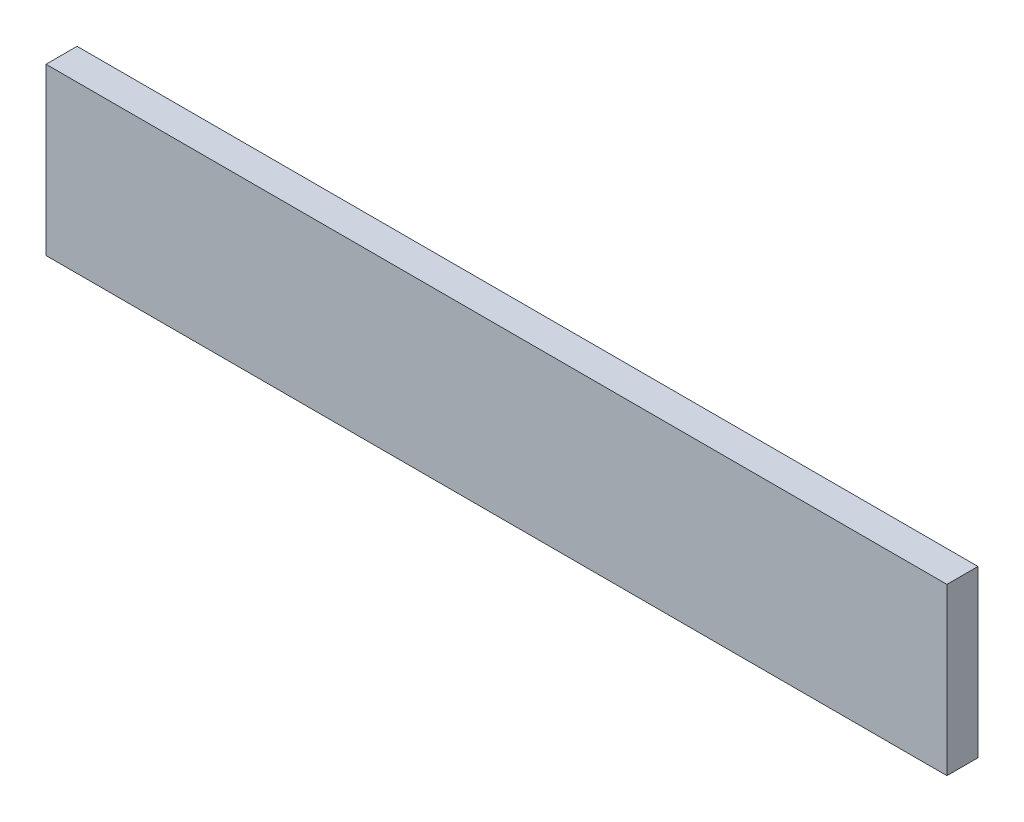
ISO-10303-21;
HEADER;
FILE_DESCRIPTION(('STEP AP214'),'2;1');
FILE_NAME('part.step','',(''),(''),'','','');
FILE_SCHEMA(('AUTOMOTIVE_DESIGN { 1 0 10303 214 1 1 1 1 }'));
ENDSEC;
DATA;
#1=APPLICATION_CONTEXT('core data for automotive mechanical design processes');
#2=APPLICATION_PROTOCOL_DEFINITION('international standard','automotive_design',2000,#1);
#3=PRODUCT_CONTEXT('',#1,'mechanical');
#4=PRODUCT('Part','Part','',(#3));
#5=PRODUCT_RELATED_PRODUCT_CATEGORY('part','',(#4));
#6=PRODUCT_DEFINITION_FORMATION('','',#4);
#7=PRODUCT_DEFINITION_CONTEXT('part definition',#1,'design');
#8=PRODUCT_DEFINITION('design','',#6,#7);
#9=PRODUCT_DEFINITION_SHAPE('','',#8);
#10=(LENGTH_UNIT() NAMED_UNIT(*) SI_UNIT(.MILLI.,.METRE.));
#11=(NAMED_UNIT(*) PLANE_ANGLE_UNIT() SI_UNIT($,.RADIAN.));
#12=(NAMED_UNIT(*) SI_UNIT($,.STERADIAN.) SOLID_ANGLE_UNIT());
#13=UNCERTAINTY_MEASURE_WITH_UNIT(LENGTH_MEASURE(1.E-05),#10,'distance_accuracy_value','');
#14=(GEOMETRIC_REPRESENTATION_CONTEXT(3) GLOBAL_UNCERTAINTY_ASSIGNED_CONTEXT((#13)) GLOBAL_UNIT_ASSIGNED_CONTEXT((#10,
#11,#12)) REPRESENTATION_CONTEXT('',''));
#15=CARTESIAN_POINT('',(0.,0.,0.));
#16=DIRECTION('',(0.,0.,1.));
#17=DIRECTION('',(1.,0.,0.));
#18=AXIS2_PLACEMENT_3D('',#15,#16,#17);
#19=CARTESIAN_POINT('',(276.225,-50.8,19.05));
#20=DIRECTION('',(-1.,0.,0.));
#21=DIRECTION('',(0.,0.,1.));
#22=AXIS2_PLACEMENT_3D('',#19,#20,#21);
#23=PLANE('',#22);
#24=DIRECTION('',(0.,1.,0.));
#25=VECTOR('',#24,1.);
#26=CARTESIAN_POINT('',(276.225,-50.8,0.));
#27=LINE('',#26,#25);
#28=CARTESIAN_POINT('',(276.225,-50.8,0.));
#29=VERTEX_POINT('',#28);
#30=CARTESIAN_POINT('',(276.225,50.8,0.));
#31=VERTEX_POINT('',#30);
#32=EDGE_CURVE('E107',#29,#31,#27,.T.);
#33=ORIENTED_EDGE('',*,*,#32,.T.);
#34=DIRECTION('',(0.,0.,-1.));
#35=VECTOR('',#34,1.);
#36=CARTESIAN_POINT('',(276.225,50.8,19.05));
#37=LINE('',#36,#35);
#38=CARTESIAN_POINT('',(276.225,50.8,19.05));
#39=VERTEX_POINT('',#38);
#40=EDGE_CURVE('E11',#39,#31,#37,.T.);
#41=ORIENTED_EDGE('',*,*,#40,.F.);
#42=DIRECTION('',(0.,1.,0.));
#43=VECTOR('',#42,1.);
#44=CARTESIAN_POINT('',(276.225,-50.8,19.05));
#45=LINE('',#44,#43);
#46=CARTESIAN_POINT('',(276.225,-50.8,19.05));
#47=VERTEX_POINT('',#46);
#48=EDGE_CURVE('E91',#47,#39,#45,.T.);
#49=ORIENTED_EDGE('',*,*,#48,.F.);
#50=DIRECTION('',(0.,0.,-1.));
#51=VECTOR('',#50,1.);
#52=CARTESIAN_POINT('',(276.225,-50.8,19.05));
#53=LINE('',#52,#51);
#54=EDGE_CURVE('E103',#47,#29,#53,.T.);
#55=ORIENTED_EDGE('',*,*,#54,.T.);
#56=EDGE_LOOP('',(#33,#41,#49,#55));
#57=FACE_BOUND('',#56,.T.);
#58=ADVANCED_FACE('F39',(#57),#23,.F.);
#59=CARTESIAN_POINT('',(-276.225,50.8,19.05));
#60=DIRECTION('',(0.,-1.,0.));
#61=DIRECTION('',(0.,0.,-1.));
#62=AXIS2_PLACEMENT_3D('',#59,#60,#61);
#63=PLANE('',#62);
#64=DIRECTION('',(-1.,0.,0.));
#65=VECTOR('',#64,1.);
#66=CARTESIAN_POINT('',(-276.225,50.8,0.));
#67=LINE('',#66,#65);
#68=CARTESIAN_POINT('',(-276.225,50.8,0.));
#69=VERTEX_POINT('',#68);
#70=EDGE_CURVE('E96',#31,#69,#67,.T.);
#71=ORIENTED_EDGE('',*,*,#70,.T.);
#72=DIRECTION('',(0.,0.,-1.));
#73=VECTOR('',#72,1.);
#74=CARTESIAN_POINT('',(-276.225,50.8,19.05));
#75=LINE('',#74,#73);
#76=CARTESIAN_POINT('',(-276.225,50.8,19.05));
#77=VERTEX_POINT('',#76);
#78=EDGE_CURVE('E48',#77,#69,#75,.T.);
#79=ORIENTED_EDGE('',*,*,#78,.F.);
#80=DIRECTION('',(-1.,0.,0.));
#81=VECTOR('',#80,1.);
#82=CARTESIAN_POINT('',(-276.225,50.8,19.05));
#83=LINE('',#82,#81);
#84=EDGE_CURVE('E86',#39,#77,#83,.T.);
#85=ORIENTED_EDGE('',*,*,#84,.F.);
#86=ORIENTED_EDGE('',*,*,#40,.T.);
#87=EDGE_LOOP('',(#71,#79,#85,#86));
#88=FACE_BOUND('',#87,.T.);
#89=ADVANCED_FACE('F95',(#88),#63,.F.);
#90=CARTESIAN_POINT('',(-276.225,-50.8,19.05));
#91=DIRECTION('',(1.,0.,0.));
#92=DIRECTION('',(0.,0.,-1.));
#93=AXIS2_PLACEMENT_3D('',#90,#91,#92);
#94=PLANE('',#93);
#95=DIRECTION('',(0.,-1.,0.));
#96=VECTOR('',#95,1.);
#97=CARTESIAN_POINT('',(-276.225,-50.8,0.));
#98=LINE('',#97,#96);
#99=CARTESIAN_POINT('',(-276.225,-50.8,0.));
#100=VERTEX_POINT('',#99);
#101=EDGE_CURVE('E73',#69,#100,#98,.T.);
#102=ORIENTED_EDGE('',*,*,#101,.T.);
#103=DIRECTION('',(0.,0.,-1.));
#104=VECTOR('',#103,1.);
#105=CARTESIAN_POINT('',(-276.225,-50.8,19.05));
#106=LINE('',#105,#104);
#107=CARTESIAN_POINT('',(-276.225,-50.8,19.05));
#108=VERTEX_POINT('',#107);
#109=EDGE_CURVE('E98',#108,#100,#106,.T.);
#110=ORIENTED_EDGE('',*,*,#109,.F.);
#111=DIRECTION('',(0.,-1.,0.));
#112=VECTOR('',#111,1.);
#113=CARTESIAN_POINT('',(-276.225,-50.8,19.05));
#114=LINE('',#113,#112);
#115=EDGE_CURVE('E89',#77,#108,#114,.T.);
#116=ORIENTED_EDGE('',*,*,#115,.F.);
#117=ORIENTED_EDGE('',*,*,#78,.T.);
#118=EDGE_LOOP('',(#102,#110,#116,#117));
#119=FACE_BOUND('',#118,.T.);
#120=ADVANCED_FACE('F99',(#119),#94,.F.);
#121=CARTESIAN_POINT('',(-276.225,-50.8,19.05));
#122=DIRECTION('',(0.,1.,0.));
#123=DIRECTION('',(0.,0.,1.));
#124=AXIS2_PLACEMENT_3D('',#121,#122,#123);
#125=PLANE('',#124);
#126=DIRECTION('',(1.,0.,0.));
#127=VECTOR('',#126,1.);
#128=CARTESIAN_POINT('',(-276.225,-50.8,0.));
#129=LINE('',#128,#127);
#130=EDGE_CURVE('E79',#100,#29,#129,.T.);
#131=ORIENTED_EDGE('',*,*,#130,.T.);
#132=ORIENTED_EDGE('',*,*,#54,.F.);
#133=DIRECTION('',(1.,0.,0.));
#134=VECTOR('',#133,1.);
#135=CARTESIAN_POINT('',(-276.225,-50.8,19.05));
#136=LINE('',#135,#134);
#137=EDGE_CURVE('E56',#108,#47,#136,.T.);
#138=ORIENTED_EDGE('',*,*,#137,.F.);
#139=ORIENTED_EDGE('',*,*,#109,.T.);
#140=EDGE_LOOP('',(#131,#132,#138,#139));
#141=FACE_BOUND('',#140,.T.);
#142=ADVANCED_FACE('F120',(#141),#125,.F.);
#143=CARTESIAN_POINT('',(0.,0.,19.05));
#144=DIRECTION('',(0.,0.,-1.));
#145=DIRECTION('',(-1.,0.,0.));
#146=AXIS2_PLACEMENT_3D('',#143,#144,#145);
#147=PLANE('',#146);
#148=ORIENTED_EDGE('',*,*,#48,.T.);
#149=ORIENTED_EDGE('',*,*,#84,.T.);
#150=ORIENTED_EDGE('',*,*,#115,.T.);
#151=ORIENTED_EDGE('',*,*,#137,.T.);
#152=EDGE_LOOP('',(#148,#149,#150,#151));
#153=FACE_BOUND('',#152,.T.);
#154=ADVANCED_FACE('F87',(#153),#147,.F.);
#155=CARTESIAN_POINT('',(0.,0.,0.));
#156=DIRECTION('',(0.,0.,-1.));
#157=DIRECTION('',(-1.,0.,0.));
#158=AXIS2_PLACEMENT_3D('',#155,#156,#157);
#159=PLANE('',#158);
#160=ORIENTED_EDGE('',*,*,#32,.F.);
#161=ORIENTED_EDGE('',*,*,#130,.F.);
#162=ORIENTED_EDGE('',*,*,#101,.F.);
#163=ORIENTED_EDGE('',*,*,#70,.F.);
#164=EDGE_LOOP('',(#160,#161,#162,#163));
#165=FACE_BOUND('',#164,.T.);
#166=ADVANCED_FACE('F123',(#165),#159,.T.);
#167=CLOSED_SHELL('',(#58,#89,#120,#142,#154,#166));
#168=MANIFOLD_SOLID_BREP('B2',#167);
#169=ADVANCED_BREP_SHAPE_REPRESENTATION('',(#18,#168),#14);
#170=SHAPE_DEFINITION_REPRESENTATION(#9,#169);
ENDSEC;
END-ISO-10303-21;
